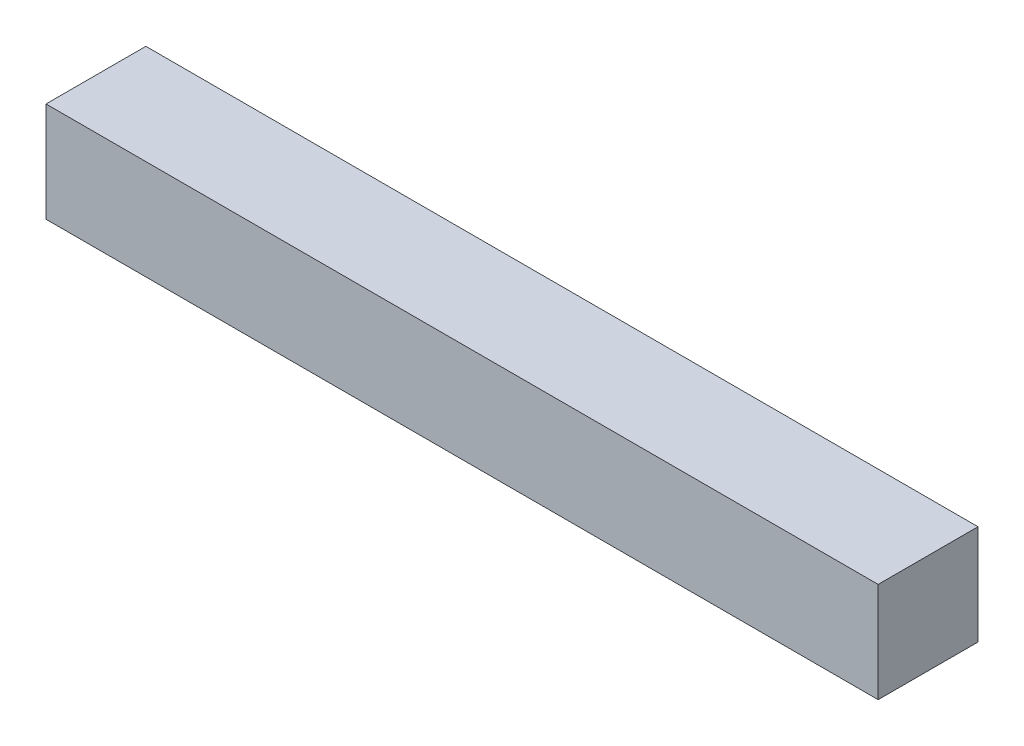
ISO-10303-21;
HEADER;
FILE_DESCRIPTION(('STEP AP214'),'2;1');
FILE_NAME('part.step','',(''),(''),'','','');
FILE_SCHEMA(('AUTOMOTIVE_DESIGN { 1 0 10303 214 1 1 1 1 }'));
ENDSEC;
DATA;
#1=APPLICATION_CONTEXT('core data for automotive mechanical design processes');
#2=APPLICATION_PROTOCOL_DEFINITION('international standard','automotive_design',2000,#1);
#3=PRODUCT_CONTEXT('',#1,'mechanical');
#4=PRODUCT('Part','Part','',(#3));
#5=PRODUCT_RELATED_PRODUCT_CATEGORY('part','',(#4));
#6=PRODUCT_DEFINITION_FORMATION('','',#4);
#7=PRODUCT_DEFINITION_CONTEXT('part definition',#1,'design');
#8=PRODUCT_DEFINITION('design','',#6,#7);
#9=PRODUCT_DEFINITION_SHAPE('','',#8);
#10=(LENGTH_UNIT() NAMED_UNIT(*) SI_UNIT(.MILLI.,.METRE.));
#11=(NAMED_UNIT(*) PLANE_ANGLE_UNIT() SI_UNIT($,.RADIAN.));
#12=(NAMED_UNIT(*) SI_UNIT($,.STERADIAN.) SOLID_ANGLE_UNIT());
#13=UNCERTAINTY_MEASURE_WITH_UNIT(LENGTH_MEASURE(1.E-05),#10,'distance_accuracy_value','');
#14=(GEOMETRIC_REPRESENTATION_CONTEXT(3) GLOBAL_UNCERTAINTY_ASSIGNED_CONTEXT((#13)) GLOBAL_UNIT_ASSIGNED_CONTEXT((#10,
#11,#12)) REPRESENTATION_CONTEXT('',''));
#15=CARTESIAN_POINT('',(0.,0.,0.));
#16=DIRECTION('',(0.,0.,1.));
#17=DIRECTION('',(1.,0.,0.));
#18=AXIS2_PLACEMENT_3D('',#15,#16,#17);
#19=CARTESIAN_POINT('',(317.5,0.,0.));
#20=DIRECTION('',(0.,0.,-1.));
#21=DIRECTION('',(0.,1.,0.));
#22=AXIS2_PLACEMENT_3D('',#19,#20,#21);
#23=PLANE('',#22);
#24=DIRECTION('',(0.,-1.,0.));
#25=VECTOR('',#24,1.);
#26=CARTESIAN_POINT('',(0.,0.,0.));
#27=LINE('',#26,#25);
#28=CARTESIAN_POINT('',(0.,0.,0.));
#29=VERTEX_POINT('',#28);
#30=CARTESIAN_POINT('',(0.,-38.1,0.));
#31=VERTEX_POINT('',#30);
#32=EDGE_CURVE('E111',#29,#31,#27,.T.);
#33=ORIENTED_EDGE('',*,*,#32,.T.);
#34=DIRECTION('',(-1.,0.,0.));
#35=VECTOR('',#34,1.);
#36=CARTESIAN_POINT('',(317.5,-38.1,0.));
#37=LINE('',#36,#35);
#38=CARTESIAN_POINT('',(317.5,-38.1,0.));
#39=VERTEX_POINT('',#38);
#40=EDGE_CURVE('E11',#39,#31,#37,.T.);
#41=ORIENTED_EDGE('',*,*,#40,.F.);
#42=DIRECTION('',(0.,-1.,0.));
#43=VECTOR('',#42,1.);
#44=CARTESIAN_POINT('',(317.5,0.,0.));
#45=LINE('',#44,#43);
#46=CARTESIAN_POINT('',(317.5,0.,0.));
#47=VERTEX_POINT('',#46);
#48=EDGE_CURVE('E95',#47,#39,#45,.T.);
#49=ORIENTED_EDGE('',*,*,#48,.F.);
#50=DIRECTION('',(-1.,0.,0.));
#51=VECTOR('',#50,1.);
#52=CARTESIAN_POINT('',(317.5,0.,0.));
#53=LINE('',#52,#51);
#54=EDGE_CURVE('E107',#47,#29,#53,.T.);
#55=ORIENTED_EDGE('',*,*,#54,.T.);
#56=EDGE_LOOP('',(#33,#41,#49,#55));
#57=FACE_BOUND('',#56,.T.);
#58=ADVANCED_FACE('F43',(#57),#23,.F.);
#59=CARTESIAN_POINT('',(317.5,-38.1,0.));
#60=DIRECTION('',(0.,1.,0.));
#61=DIRECTION('',(0.,0.,1.));
#62=AXIS2_PLACEMENT_3D('',#59,#60,#61);
#63=PLANE('',#62);
#64=DIRECTION('',(0.,0.,-1.));
#65=VECTOR('',#64,1.);
#66=CARTESIAN_POINT('',(0.,-38.1,0.));
#67=LINE('',#66,#65);
#68=CARTESIAN_POINT('',(0.,-38.1,-38.1));
#69=VERTEX_POINT('',#68);
#70=EDGE_CURVE('E100',#31,#69,#67,.T.);
#71=ORIENTED_EDGE('',*,*,#70,.T.);
#72=DIRECTION('',(-1.,0.,0.));
#73=VECTOR('',#72,1.);
#74=CARTESIAN_POINT('',(317.5,-38.1,-38.1));
#75=LINE('',#74,#73);
#76=CARTESIAN_POINT('',(317.5,-38.1,-38.1));
#77=VERTEX_POINT('',#76);
#78=EDGE_CURVE('E52',#77,#69,#75,.T.);
#79=ORIENTED_EDGE('',*,*,#78,.F.);
#80=DIRECTION('',(0.,0.,-1.));
#81=VECTOR('',#80,1.);
#82=CARTESIAN_POINT('',(317.5,-38.1,0.));
#83=LINE('',#82,#81);
#84=EDGE_CURVE('E90',#39,#77,#83,.T.);
#85=ORIENTED_EDGE('',*,*,#84,.F.);
#86=ORIENTED_EDGE('',*,*,#40,.T.);
#87=EDGE_LOOP('',(#71,#79,#85,#86));
#88=FACE_BOUND('',#87,.T.);
#89=ADVANCED_FACE('F99',(#88),#63,.F.);
#90=CARTESIAN_POINT('',(317.5,0.,-38.1));
#91=DIRECTION('',(0.,0.,1.));
#92=DIRECTION('',(0.,-1.,0.));
#93=AXIS2_PLACEMENT_3D('',#90,#91,#92);
#94=PLANE('',#93);
#95=DIRECTION('',(0.,1.,0.));
#96=VECTOR('',#95,1.);
#97=CARTESIAN_POINT('',(0.,0.,-38.1));
#98=LINE('',#97,#96);
#99=CARTESIAN_POINT('',(0.,0.,-38.1));
#100=VERTEX_POINT('',#99);
#101=EDGE_CURVE('E77',#69,#100,#98,.T.);
#102=ORIENTED_EDGE('',*,*,#101,.T.);
#103=DIRECTION('',(-1.,0.,0.));
#104=VECTOR('',#103,1.);
#105=CARTESIAN_POINT('',(317.5,0.,-38.1));
#106=LINE('',#105,#104);
#107=CARTESIAN_POINT('',(317.5,0.,-38.1));
#108=VERTEX_POINT('',#107);
#109=EDGE_CURVE('E102',#108,#100,#106,.T.);
#110=ORIENTED_EDGE('',*,*,#109,.F.);
#111=DIRECTION('',(0.,1.,0.));
#112=VECTOR('',#111,1.);
#113=CARTESIAN_POINT('',(317.5,0.,-38.1));
#114=LINE('',#113,#112);
#115=EDGE_CURVE('E93',#77,#108,#114,.T.);
#116=ORIENTED_EDGE('',*,*,#115,.F.);
#117=ORIENTED_EDGE('',*,*,#78,.T.);
#118=EDGE_LOOP('',(#102,#110,#116,#117));
#119=FACE_BOUND('',#118,.T.);
#120=ADVANCED_FACE('F103',(#119),#94,.F.);
#121=CARTESIAN_POINT('',(317.5,0.,0.));
#122=DIRECTION('',(0.,-1.,0.));
#123=DIRECTION('',(0.,0.,-1.));
#124=AXIS2_PLACEMENT_3D('',#121,#122,#123);
#125=PLANE('',#124);
#126=DIRECTION('',(0.,0.,1.));
#127=VECTOR('',#126,1.);
#128=CARTESIAN_POINT('',(0.,0.,0.));
#129=LINE('',#128,#127);
#130=EDGE_CURVE('E83',#100,#29,#129,.T.);
#131=ORIENTED_EDGE('',*,*,#130,.T.);
#132=ORIENTED_EDGE('',*,*,#54,.F.);
#133=DIRECTION('',(0.,0.,1.));
#134=VECTOR('',#133,1.);
#135=CARTESIAN_POINT('',(317.5,0.,0.));
#136=LINE('',#135,#134);
#137=EDGE_CURVE('E60',#108,#47,#136,.T.);
#138=ORIENTED_EDGE('',*,*,#137,.F.);
#139=ORIENTED_EDGE('',*,*,#109,.T.);
#140=EDGE_LOOP('',(#131,#132,#138,#139));
#141=FACE_BOUND('',#140,.T.);
#142=ADVANCED_FACE('F124',(#141),#125,.F.);
#143=CARTESIAN_POINT('',(317.5,0.,0.));
#144=DIRECTION('',(1.,0.,0.));
#145=DIRECTION('',(0.,0.,-1.));
#146=AXIS2_PLACEMENT_3D('',#143,#144,#145);
#147=PLANE('',#146);
#148=ORIENTED_EDGE('',*,*,#48,.T.);
#149=ORIENTED_EDGE('',*,*,#84,.T.);
#150=ORIENTED_EDGE('',*,*,#115,.T.);
#151=ORIENTED_EDGE('',*,*,#137,.T.);
#152=EDGE_LOOP('',(#148,#149,#150,#151));
#153=FACE_BOUND('',#152,.T.);
#154=ADVANCED_FACE('F91',(#153),#147,.T.);
#155=CARTESIAN_POINT('',(0.,0.,0.));
#156=DIRECTION('',(1.,0.,0.));
#157=DIRECTION('',(0.,0.,-1.));
#158=AXIS2_PLACEMENT_3D('',#155,#156,#157);
#159=PLANE('',#158);
#160=ORIENTED_EDGE('',*,*,#32,.F.);
#161=ORIENTED_EDGE('',*,*,#130,.F.);
#162=ORIENTED_EDGE('',*,*,#101,.F.);
#163=ORIENTED_EDGE('',*,*,#70,.F.);
#164=EDGE_LOOP('',(#160,#161,#162,#163));
#165=FACE_BOUND('',#164,.T.);
#166=ADVANCED_FACE('F127',(#165),#159,.F.);
#167=CLOSED_SHELL('',(#58,#89,#120,#142,#154,#166));
#168=MANIFOLD_SOLID_BREP('B2',#167);
#169=ADVANCED_BREP_SHAPE_REPRESENTATION('',(#18,#168),#14);
#170=SHAPE_DEFINITION_REPRESENTATION(#9,#169);
ENDSEC;
END-ISO-10303-21;
